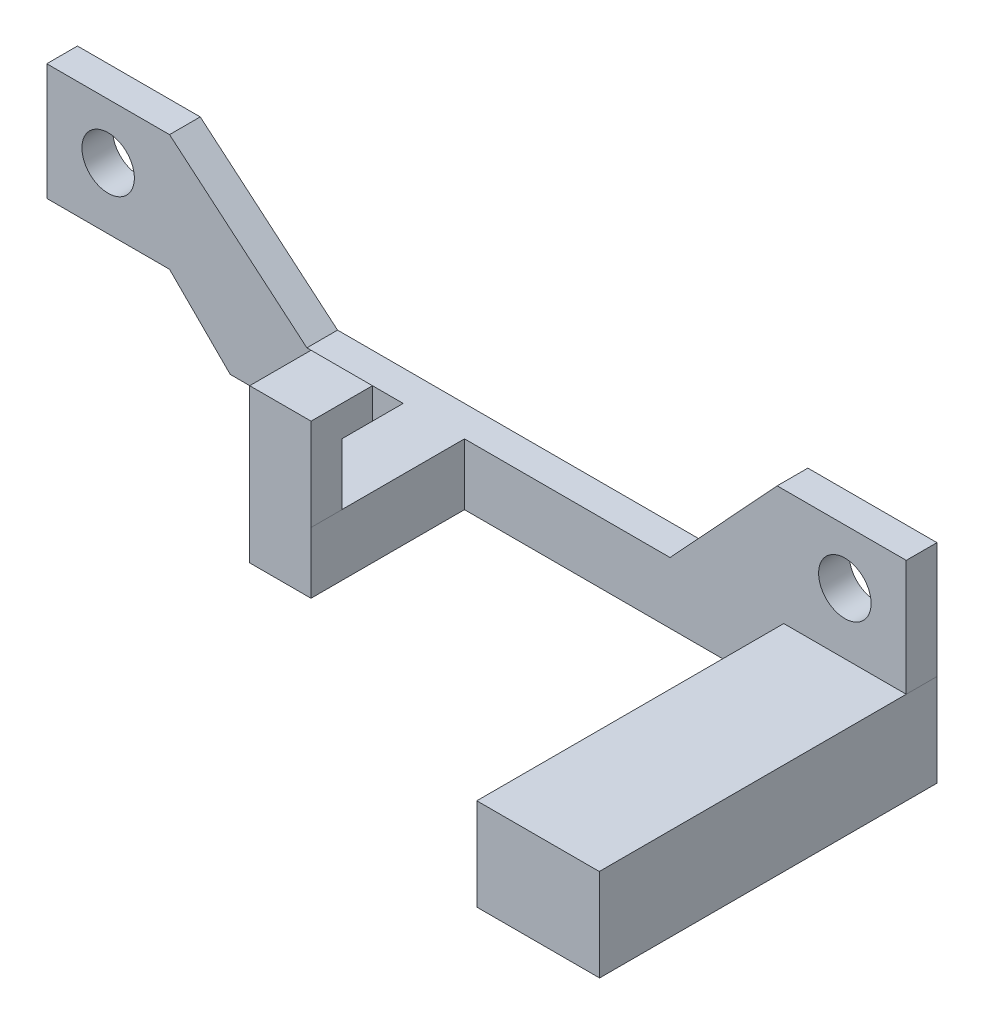
ISO-10303-21;
HEADER;
FILE_DESCRIPTION(('STEP AP214'),'2;1');
FILE_NAME('part.step','',(''),(''),'','','');
FILE_SCHEMA(('AUTOMOTIVE_DESIGN { 1 0 10303 214 1 1 1 1 }'));
ENDSEC;
DATA;
#1=APPLICATION_CONTEXT('core data for automotive mechanical design processes');
#2=APPLICATION_PROTOCOL_DEFINITION('international standard','automotive_design',2000,#1);
#3=PRODUCT_CONTEXT('',#1,'mechanical');
#4=PRODUCT('Part','Part','',(#3));
#5=PRODUCT_RELATED_PRODUCT_CATEGORY('part','',(#4));
#6=PRODUCT_DEFINITION_FORMATION('','',#4);
#7=PRODUCT_DEFINITION_CONTEXT('part definition',#1,'design');
#8=PRODUCT_DEFINITION('design','',#6,#7);
#9=PRODUCT_DEFINITION_SHAPE('','',#8);
#10=(LENGTH_UNIT() NAMED_UNIT(*) SI_UNIT(.MILLI.,.METRE.));
#11=(NAMED_UNIT(*) PLANE_ANGLE_UNIT() SI_UNIT($,.RADIAN.));
#12=(NAMED_UNIT(*) SI_UNIT($,.STERADIAN.) SOLID_ANGLE_UNIT());
#13=UNCERTAINTY_MEASURE_WITH_UNIT(LENGTH_MEASURE(1.E-05),#10,'distance_accuracy_value','');
#14=(GEOMETRIC_REPRESENTATION_CONTEXT(3) GLOBAL_UNCERTAINTY_ASSIGNED_CONTEXT((#13)) GLOBAL_UNIT_ASSIGNED_CONTEXT((#10,
#11,#12)) REPRESENTATION_CONTEXT('',''));
#15=CARTESIAN_POINT('',(0.,0.,0.));
#16=DIRECTION('',(0.,0.,1.));
#17=DIRECTION('',(1.,0.,0.));
#18=AXIS2_PLACEMENT_3D('',#15,#16,#17);
#19=CARTESIAN_POINT('',(0.,0.,2.54));
#20=DIRECTION('',(0.,0.,1.));
#21=DIRECTION('',(1.,0.,0.));
#22=AXIS2_PLACEMENT_3D('',#19,#20,#21);
#23=PLANE('',#22);
#24=CARTESIAN_POINT('',(0.,0.,2.54));
#25=DIRECTION('',(0.,0.,1.));
#26=DIRECTION('',(1.,0.,0.));
#27=AXIS2_PLACEMENT_3D('',#24,#25,#26);
#28=CIRCLE('',#27,2.1717);
#29=CARTESIAN_POINT('',(2.1717,0.,2.54));
#30=VERTEX_POINT('',#29);
#31=EDGE_CURVE('E720',#30,#30,#28,.T.);
#32=ORIENTED_EDGE('',*,*,#31,.F.);
#33=EDGE_LOOP('',(#32));
#34=FACE_BOUND('',#33,.T.);
#35=DIRECTION('',(1.,0.,0.));
#36=VECTOR('',#35,1.);
#37=CARTESIAN_POINT('',(0.,-10.1021143985678,2.54));
#38=LINE('',#37,#36);
#39=CARTESIAN_POINT('',(10.102114398568,-10.1021143985678,2.54));
#40=VERTEX_POINT('',#39);
#41=CARTESIAN_POINT('',(24.4116480258327,-10.1021143985679,2.54));
#42=VERTEX_POINT('',#41);
#43=EDGE_CURVE('E741',#40,#42,#38,.T.);
#44=ORIENTED_EDGE('',*,*,#43,.T.);
#45=DIRECTION('',(0.,-1.,0.));
#46=VECTOR('',#45,1.);
#47=CARTESIAN_POINT('',(24.4116480258327,-5.02527026640652,2.54));
#48=LINE('',#47,#46);
#49=CARTESIAN_POINT('',(24.4116480258327,-5.02527026640652,2.54));
#50=VERTEX_POINT('',#49);
#51=EDGE_CURVE('E626',#50,#42,#48,.T.);
#52=ORIENTED_EDGE('',*,*,#51,.F.);
#53=DIRECTION('',(-1.,0.,0.));
#54=VECTOR('',#53,1.);
#55=CARTESIAN_POINT('',(0.,-5.02527026640652,2.54));
#56=LINE('',#55,#54);
#57=CARTESIAN_POINT('',(16.4442838158998,-5.02527026640652,2.54));
#58=VERTEX_POINT('',#57);
#59=EDGE_CURVE('E66',#50,#58,#56,.T.);
#60=ORIENTED_EDGE('',*,*,#59,.T.);
#61=DIRECTION('',(0.764004598915688,-0.64521079720947,0.));
#62=VECTOR('',#61,1.);
#63=CARTESIAN_POINT('',(4.36852866470301,5.17284584319278,2.54));
#64=LINE('',#63,#62);
#65=CARTESIAN_POINT('',(5.08,4.572,2.54));
#66=VERTEX_POINT('',#65);
#67=EDGE_CURVE('E724',#66,#58,#64,.T.);
#68=ORIENTED_EDGE('',*,*,#67,.F.);
#69=DIRECTION('',(1.,0.,0.));
#70=VECTOR('',#69,1.);
#71=CARTESIAN_POINT('',(0.,4.572,2.54));
#72=LINE('',#71,#70);
#73=CARTESIAN_POINT('',(-5.08,4.572,2.54));
#74=VERTEX_POINT('',#73);
#75=EDGE_CURVE('E727',#74,#66,#72,.T.);
#76=ORIENTED_EDGE('',*,*,#75,.F.);
#77=DIRECTION('',(0.,1.,0.));
#78=VECTOR('',#77,1.);
#79=CARTESIAN_POINT('',(-5.08,0.,2.54));
#80=LINE('',#79,#78);
#81=CARTESIAN_POINT('',(-5.08,-5.08,2.54));
#82=VERTEX_POINT('',#81);
#83=EDGE_CURVE('E203',#82,#74,#80,.T.);
#84=ORIENTED_EDGE('',*,*,#83,.F.);
#85=DIRECTION('',(-1.,0.,0.));
#86=VECTOR('',#85,1.);
#87=CARTESIAN_POINT('',(0.,-5.08,2.54));
#88=LINE('',#87,#86);
#89=CARTESIAN_POINT('',(5.08,-5.08,2.54));
#90=VERTEX_POINT('',#89);
#91=EDGE_CURVE('E732',#90,#82,#88,.T.);
#92=ORIENTED_EDGE('',*,*,#91,.F.);
#93=DIRECTION('',(0.707106781186556,-0.707106781186539,0.));
#94=VECTOR('',#93,1.);
#95=CARTESIAN_POINT('',(0.,0.,2.54));
#96=LINE('',#95,#94);
#97=EDGE_CURVE('E736',#90,#40,#96,.T.);
#98=ORIENTED_EDGE('',*,*,#97,.T.);
#99=EDGE_LOOP('',(#44,#52,#60,#68,#76,#84,#92,#98));
#100=FACE_BOUND('',#99,.T.);
#101=ADVANCED_FACE('F41',(#34,#100),#23,.T.);
#102=CARTESIAN_POINT('',(60.96,0.,2.54));
#103=DIRECTION('',(0.,0.,1.));
#104=DIRECTION('',(1.,0.,0.));
#105=AXIS2_PLACEMENT_3D('',#102,#103,#104);
#106=CIRCLE('',#105,2.17169999999999);
#107=CARTESIAN_POINT('',(63.1317,0.,2.54));
#108=VERTEX_POINT('',#107);
#109=EDGE_CURVE('E248',#108,#108,#106,.T.);
#110=ORIENTED_EDGE('',*,*,#109,.F.);
#111=EDGE_LOOP('',(#110));
#112=FACE_BOUND('',#111,.T.);
#113=CARTESIAN_POINT('',(46.4985645628531,-5.02527026640651,2.54));
#114=VERTEX_POINT('',#113);
#115=CARTESIAN_POINT('',(29.4860322595412,-5.02527026640651,2.54));
#116=VERTEX_POINT('',#115);
#117=EDGE_CURVE('E250',#114,#116,#56,.T.);
#118=ORIENTED_EDGE('',*,*,#117,.T.);
#119=DIRECTION('',(0.,1.,0.));
#120=VECTOR('',#119,1.);
#121=CARTESIAN_POINT('',(29.4860322595412,-10.1021143985679,2.54));
#122=LINE('',#121,#120);
#123=CARTESIAN_POINT('',(29.4860322595412,-10.1021143985679,2.54));
#124=VERTEX_POINT('',#123);
#125=EDGE_CURVE('E646',#124,#116,#122,.T.);
#126=ORIENTED_EDGE('',*,*,#125,.F.);
#127=CARTESIAN_POINT('',(51.2288276745679,-10.1021143985679,2.54));
#128=VERTEX_POINT('',#127);
#129=EDGE_CURVE('E740',#124,#128,#38,.T.);
#130=ORIENTED_EDGE('',*,*,#129,.T.);
#131=DIRECTION('',(0.679491903281779,0.733683006055412,0.));
#132=VECTOR('',#131,1.);
#133=CARTESIAN_POINT('',(32.6122281261883,-30.2034322409393,2.54));
#134=LINE('',#133,#132);
#135=CARTESIAN_POINT('',(55.9053436198552,-5.05263513320329,2.54));
#136=VERTEX_POINT('',#135);
#137=EDGE_CURVE('E745',#128,#136,#134,.T.);
#138=ORIENTED_EDGE('',*,*,#137,.T.);
#139=DIRECTION('',(-1.,0.,0.));
#140=VECTOR('',#139,1.);
#141=CARTESIAN_POINT('',(0.,-5.05263513320329,2.54));
#142=LINE('',#141,#140);
#143=CARTESIAN_POINT('',(66.0399999697102,-5.05263513320329,2.54));
#144=VERTEX_POINT('',#143);
#145=EDGE_CURVE('E749',#144,#136,#142,.T.);
#146=ORIENTED_EDGE('',*,*,#145,.F.);
#147=DIRECTION('',(0.,1.,0.));
#148=VECTOR('',#147,1.);
#149=CARTESIAN_POINT('',(66.0399999697102,0.,2.54));
#150=LINE('',#149,#148);
#151=CARTESIAN_POINT('',(66.0399999697102,4.54395621284335,2.54));
#152=VERTEX_POINT('',#151);
#153=EDGE_CURVE('E155',#144,#152,#150,.T.);
#154=ORIENTED_EDGE('',*,*,#153,.T.);
#155=DIRECTION('',(-1.,0.,0.));
#156=VECTOR('',#155,1.);
#157=CARTESIAN_POINT('',(0.,4.54395621284335,2.54));
#158=LINE('',#157,#156);
#159=CARTESIAN_POINT('',(55.3583605516078,4.54395621284335,2.54));
#160=VERTEX_POINT('',#159);
#161=EDGE_CURVE('E149',#152,#160,#158,.T.);
#162=ORIENTED_EDGE('',*,*,#161,.T.);
#163=DIRECTION('',(-0.679383305109455,-0.733783568048885,0.));
#164=VECTOR('',#163,1.);
#165=CARTESIAN_POINT('',(27.5418084753844,-25.4999507831056,2.54));
#166=LINE('',#165,#164);
#167=EDGE_CURVE('E137',#160,#114,#166,.T.);
#168=ORIENTED_EDGE('',*,*,#167,.T.);
#169=EDGE_LOOP('',(#118,#126,#130,#138,#146,#154,#162,#168));
#170=FACE_BOUND('',#169,.T.);
#171=ADVANCED_FACE('F152',(#112,#170),#23,.T.);
#172=CARTESIAN_POINT('',(4.36852866470301,5.17284584319278,2.54));
#173=DIRECTION('',(0.64521079720947,0.764004598915688,0.));
#174=DIRECTION('',(-0.764004598915688,0.64521079720947,0.));
#175=AXIS2_PLACEMENT_3D('',#172,#173,#174);
#176=PLANE('',#175);
#177=DIRECTION('',(0.764004598915688,-0.64521079720947,0.));
#178=VECTOR('',#177,1.);
#179=CARTESIAN_POINT('',(4.36852866470301,5.17284584319278,0.));
#180=LINE('',#179,#178);
#181=CARTESIAN_POINT('',(5.08,4.572,0.));
#182=VERTEX_POINT('',#181);
#183=CARTESIAN_POINT('',(16.4442838158998,-5.02527026640652,0.));
#184=VERTEX_POINT('',#183);
#185=EDGE_CURVE('E213',#182,#184,#180,.T.);
#186=ORIENTED_EDGE('',*,*,#185,.F.);
#187=DIRECTION('',(0.,0.,-1.));
#188=VECTOR('',#187,1.);
#189=CARTESIAN_POINT('',(5.08,4.572,2.54));
#190=LINE('',#189,#188);
#191=EDGE_CURVE('E11',#66,#182,#190,.T.);
#192=ORIENTED_EDGE('',*,*,#191,.F.);
#193=ORIENTED_EDGE('',*,*,#67,.T.);
#194=DIRECTION('',(0.,0.,-1.));
#195=VECTOR('',#194,1.);
#196=CARTESIAN_POINT('',(16.4442838158998,-5.02527026640652,2.54));
#197=LINE('',#196,#195);
#198=EDGE_CURVE('E108',#58,#184,#197,.T.);
#199=ORIENTED_EDGE('',*,*,#198,.T.);
#200=EDGE_LOOP('',(#186,#192,#193,#199));
#201=FACE_BOUND('',#200,.T.);
#202=ADVANCED_FACE('F265',(#201),#176,.T.);
#203=CARTESIAN_POINT('',(0.,4.572,2.54));
#204=DIRECTION('',(0.,1.,0.));
#205=DIRECTION('',(0.,0.,1.));
#206=AXIS2_PLACEMENT_3D('',#203,#204,#205);
#207=PLANE('',#206);
#208=DIRECTION('',(1.,0.,0.));
#209=VECTOR('',#208,1.);
#210=CARTESIAN_POINT('',(0.,4.572,0.));
#211=LINE('',#210,#209);
#212=CARTESIAN_POINT('',(-5.08,4.572,0.));
#213=VERTEX_POINT('',#212);
#214=EDGE_CURVE('E208',#213,#182,#211,.T.);
#215=ORIENTED_EDGE('',*,*,#214,.F.);
#216=DIRECTION('',(0.,0.,-1.));
#217=VECTOR('',#216,1.);
#218=CARTESIAN_POINT('',(-5.08,4.572,2.54));
#219=LINE('',#218,#217);
#220=EDGE_CURVE('E50',#74,#213,#219,.T.);
#221=ORIENTED_EDGE('',*,*,#220,.F.);
#222=ORIENTED_EDGE('',*,*,#75,.T.);
#223=ORIENTED_EDGE('',*,*,#191,.T.);
#224=EDGE_LOOP('',(#215,#221,#222,#223));
#225=FACE_BOUND('',#224,.T.);
#226=ADVANCED_FACE('F209',(#225),#207,.T.);
#227=CARTESIAN_POINT('',(-5.08,0.,2.54));
#228=DIRECTION('',(-1.,0.,0.));
#229=DIRECTION('',(0.,0.,1.));
#230=AXIS2_PLACEMENT_3D('',#227,#228,#229);
#231=PLANE('',#230);
#232=DIRECTION('',(0.,1.,0.));
#233=VECTOR('',#232,1.);
#234=CARTESIAN_POINT('',(-5.08,0.,0.));
#235=LINE('',#234,#233);
#236=CARTESIAN_POINT('',(-5.08,-5.08,0.));
#237=VERTEX_POINT('',#236);
#238=EDGE_CURVE('E200',#237,#213,#235,.T.);
#239=ORIENTED_EDGE('',*,*,#238,.F.);
#240=DIRECTION('',(0.,0.,-1.));
#241=VECTOR('',#240,1.);
#242=CARTESIAN_POINT('',(-5.08,-5.08,2.54));
#243=LINE('',#242,#241);
#244=EDGE_CURVE('E191',#82,#237,#243,.T.);
#245=ORIENTED_EDGE('',*,*,#244,.F.);
#246=ORIENTED_EDGE('',*,*,#83,.T.);
#247=ORIENTED_EDGE('',*,*,#220,.T.);
#248=EDGE_LOOP('',(#239,#245,#246,#247));
#249=FACE_BOUND('',#248,.T.);
#250=ADVANCED_FACE('F198',(#249),#231,.T.);
#251=CARTESIAN_POINT('',(0.,-5.08,2.54));
#252=DIRECTION('',(0.,-1.,0.));
#253=DIRECTION('',(1.,0.,0.));
#254=AXIS2_PLACEMENT_3D('',#251,#252,#253);
#255=PLANE('',#254);
#256=DIRECTION('',(-1.,0.,0.));
#257=VECTOR('',#256,1.);
#258=CARTESIAN_POINT('',(0.,-5.08,0.));
#259=LINE('',#258,#257);
#260=CARTESIAN_POINT('',(5.08,-5.08,0.));
#261=VERTEX_POINT('',#260);
#262=EDGE_CURVE('E218',#261,#237,#259,.T.);
#263=ORIENTED_EDGE('',*,*,#262,.F.);
#264=DIRECTION('',(0.,0.,-1.));
#265=VECTOR('',#264,1.);
#266=CARTESIAN_POINT('',(5.08,-5.08,2.54));
#267=LINE('',#266,#265);
#268=EDGE_CURVE('E188',#90,#261,#267,.T.);
#269=ORIENTED_EDGE('',*,*,#268,.F.);
#270=ORIENTED_EDGE('',*,*,#91,.T.);
#271=ORIENTED_EDGE('',*,*,#244,.T.);
#272=EDGE_LOOP('',(#263,#269,#270,#271));
#273=FACE_BOUND('',#272,.T.);
#274=ADVANCED_FACE('F311',(#273),#255,.T.);
#275=CARTESIAN_POINT('',(0.,0.,2.54));
#276=DIRECTION('',(0.707106781186539,0.707106781186556,0.));
#277=DIRECTION('',(-0.707106781186556,0.707106781186539,0.));
#278=AXIS2_PLACEMENT_3D('',#275,#276,#277);
#279=PLANE('',#278);
#280=DIRECTION('',(0.707106781186556,-0.707106781186539,0.));
#281=VECTOR('',#280,1.);
#282=CARTESIAN_POINT('',(0.,0.,0.));
#283=LINE('',#282,#281);
#284=CARTESIAN_POINT('',(10.102114398568,-10.1021143985678,0.));
#285=VERTEX_POINT('',#284);
#286=EDGE_CURVE('E222',#261,#285,#283,.T.);
#287=ORIENTED_EDGE('',*,*,#286,.T.);
#288=DIRECTION('',(0.,0.,-1.));
#289=VECTOR('',#288,1.);
#290=CARTESIAN_POINT('',(10.102114398568,-10.1021143985678,2.54));
#291=LINE('',#290,#289);
#292=EDGE_CURVE('E184',#40,#285,#291,.T.);
#293=ORIENTED_EDGE('',*,*,#292,.F.);
#294=ORIENTED_EDGE('',*,*,#97,.F.);
#295=ORIENTED_EDGE('',*,*,#268,.T.);
#296=EDGE_LOOP('',(#287,#293,#294,#295));
#297=FACE_BOUND('',#296,.T.);
#298=ADVANCED_FACE('F307',(#297),#279,.F.);
#299=CARTESIAN_POINT('',(0.,-10.1021143985678,2.54));
#300=DIRECTION('',(0.,1.,0.));
#301=DIRECTION('',(-1.,0.,0.));
#302=AXIS2_PLACEMENT_3D('',#299,#300,#301);
#303=PLANE('',#302);
#304=DIRECTION('',(1.,0.,0.));
#305=VECTOR('',#304,1.);
#306=CARTESIAN_POINT('',(0.,-10.1021143985678,0.));
#307=LINE('',#306,#305);
#308=CARTESIAN_POINT('',(51.2288276745679,-10.1021143985679,0.));
#309=VERTEX_POINT('',#308);
#310=EDGE_CURVE('E229',#285,#309,#307,.T.);
#311=ORIENTED_EDGE('',*,*,#310,.T.);
#312=DIRECTION('',(0.,0.,-1.));
#313=VECTOR('',#312,1.);
#314=CARTESIAN_POINT('',(51.2288276745679,-10.1021143985679,2.54));
#315=LINE('',#314,#313);
#316=EDGE_CURVE('E180',#128,#309,#315,.T.);
#317=ORIENTED_EDGE('',*,*,#316,.F.);
#318=ORIENTED_EDGE('',*,*,#129,.F.);
#319=DIRECTION('',(0.,0.,-1.));
#320=VECTOR('',#319,1.);
#321=CARTESIAN_POINT('',(29.4860322595412,-10.1021143985679,15.24));
#322=LINE('',#321,#320);
#323=CARTESIAN_POINT('',(29.4860322595412,-10.1021143985679,15.24));
#324=VERTEX_POINT('',#323);
#325=EDGE_CURVE('E57',#324,#124,#322,.T.);
#326=ORIENTED_EDGE('',*,*,#325,.F.);
#327=DIRECTION('',(1.,0.,0.));
#328=VECTOR('',#327,1.);
#329=CARTESIAN_POINT('',(24.4116480258327,-10.1021143985679,15.24));
#330=LINE('',#329,#328);
#331=CARTESIAN_POINT('',(24.4116480258327,-10.1021143985679,15.24));
#332=VERTEX_POINT('',#331);
#333=EDGE_CURVE('E645',#332,#324,#330,.T.);
#334=ORIENTED_EDGE('',*,*,#333,.F.);
#335=DIRECTION('',(0.,0.,-1.));
#336=VECTOR('',#335,1.);
#337=CARTESIAN_POINT('',(24.4116480258327,-10.1021143985679,15.24));
#338=LINE('',#337,#336);
#339=EDGE_CURVE('E666',#332,#42,#338,.T.);
#340=ORIENTED_EDGE('',*,*,#339,.T.);
#341=ORIENTED_EDGE('',*,*,#43,.F.);
#342=ORIENTED_EDGE('',*,*,#292,.T.);
#343=EDGE_LOOP('',(#311,#317,#318,#326,#334,#340,#341,#342));
#344=FACE_BOUND('',#343,.T.);
#345=ADVANCED_FACE('F303',(#344),#303,.F.);
#346=CARTESIAN_POINT('',(32.6122281261883,-30.2034322409393,2.54));
#347=DIRECTION('',(-0.733683006055412,0.679491903281779,0.));
#348=DIRECTION('',(-0.679491903281779,-0.733683006055412,0.));
#349=AXIS2_PLACEMENT_3D('',#346,#347,#348);
#350=PLANE('',#349);
#351=DIRECTION('',(0.679491903281779,0.733683006055412,0.));
#352=VECTOR('',#351,1.);
#353=CARTESIAN_POINT('',(32.6122281261883,-30.2034322409393,0.));
#354=LINE('',#353,#352);
#355=CARTESIAN_POINT('',(55.9053436198552,-5.05263513320329,0.));
#356=VERTEX_POINT('',#355);
#357=EDGE_CURVE('E233',#309,#356,#354,.T.);
#358=ORIENTED_EDGE('',*,*,#357,.T.);
#359=DIRECTION('',(0.,0.,-1.));
#360=VECTOR('',#359,1.);
#361=CARTESIAN_POINT('',(55.9053436198552,-5.05263513320329,2.54));
#362=LINE('',#361,#360);
#363=EDGE_CURVE('E176',#136,#356,#362,.T.);
#364=ORIENTED_EDGE('',*,*,#363,.F.);
#365=ORIENTED_EDGE('',*,*,#137,.F.);
#366=ORIENTED_EDGE('',*,*,#316,.T.);
#367=EDGE_LOOP('',(#358,#364,#365,#366));
#368=FACE_BOUND('',#367,.T.);
#369=ADVANCED_FACE('F299',(#368),#350,.F.);
#370=CARTESIAN_POINT('',(66.0399999697102,0.,2.54));
#371=DIRECTION('',(-1.,0.,0.));
#372=DIRECTION('',(0.,0.,1.));
#373=AXIS2_PLACEMENT_3D('',#370,#371,#372);
#374=PLANE('',#373);
#375=DIRECTION('',(0.,1.,0.));
#376=VECTOR('',#375,1.);
#377=CARTESIAN_POINT('',(66.0399999697102,0.,0.));
#378=LINE('',#377,#376);
#379=CARTESIAN_POINT('',(66.0399999697102,-5.05263513320329,0.));
#380=VERTEX_POINT('',#379);
#381=CARTESIAN_POINT('',(66.0399999697102,4.54395621284335,0.));
#382=VERTEX_POINT('',#381);
#383=EDGE_CURVE('E237',#380,#382,#378,.T.);
#384=ORIENTED_EDGE('',*,*,#383,.T.);
#385=DIRECTION('',(0.,0.,-1.));
#386=VECTOR('',#385,1.);
#387=CARTESIAN_POINT('',(66.0399999697102,4.54395621284335,2.54));
#388=LINE('',#387,#386);
#389=EDGE_CURVE('E164',#152,#382,#388,.T.);
#390=ORIENTED_EDGE('',*,*,#389,.F.);
#391=ORIENTED_EDGE('',*,*,#153,.F.);
#392=DIRECTION('',(0.,0.,-1.));
#393=VECTOR('',#392,1.);
#394=CARTESIAN_POINT('',(66.0399999697102,-5.05263513320329,2.54));
#395=LINE('',#394,#393);
#396=EDGE_CURVE('E168',#144,#380,#395,.T.);
#397=ORIENTED_EDGE('',*,*,#396,.T.);
#398=EDGE_LOOP('',(#384,#390,#391,#397));
#399=FACE_BOUND('',#398,.T.);
#400=ADVANCED_FACE('F296',(#399),#374,.F.);
#401=CARTESIAN_POINT('',(0.,4.54395621284335,2.54));
#402=DIRECTION('',(0.,-1.,0.));
#403=DIRECTION('',(0.,0.,-1.));
#404=AXIS2_PLACEMENT_3D('',#401,#402,#403);
#405=PLANE('',#404);
#406=DIRECTION('',(-1.,0.,0.));
#407=VECTOR('',#406,1.);
#408=CARTESIAN_POINT('',(0.,4.54395621284335,0.));
#409=LINE('',#408,#407);
#410=CARTESIAN_POINT('',(55.3583605516078,4.54395621284335,0.));
#411=VERTEX_POINT('',#410);
#412=EDGE_CURVE('E162',#382,#411,#409,.T.);
#413=ORIENTED_EDGE('',*,*,#412,.T.);
#414=DIRECTION('',(0.,0.,-1.));
#415=VECTOR('',#414,1.);
#416=CARTESIAN_POINT('',(55.3583605516078,4.54395621284335,2.54));
#417=LINE('',#416,#415);
#418=EDGE_CURVE('E142',#160,#411,#417,.T.);
#419=ORIENTED_EDGE('',*,*,#418,.F.);
#420=ORIENTED_EDGE('',*,*,#161,.F.);
#421=ORIENTED_EDGE('',*,*,#389,.T.);
#422=EDGE_LOOP('',(#413,#419,#420,#421));
#423=FACE_BOUND('',#422,.T.);
#424=ADVANCED_FACE('F161',(#423),#405,.F.);
#425=CARTESIAN_POINT('',(27.5418084753844,-25.4999507831056,2.54));
#426=DIRECTION('',(0.733783568048885,-0.679383305109455,0.));
#427=DIRECTION('',(0.679383305109455,0.733783568048885,0.));
#428=AXIS2_PLACEMENT_3D('',#425,#426,#427);
#429=PLANE('',#428);
#430=DIRECTION('',(-0.679383305109455,-0.733783568048885,0.));
#431=VECTOR('',#430,1.);
#432=CARTESIAN_POINT('',(27.5418084753844,-25.4999507831056,0.));
#433=LINE('',#432,#431);
#434=CARTESIAN_POINT('',(46.4985645628531,-5.02527026640651,0.));
#435=VERTEX_POINT('',#434);
#436=EDGE_CURVE('E243',#411,#435,#433,.T.);
#437=ORIENTED_EDGE('',*,*,#436,.T.);
#438=DIRECTION('',(0.,0.,-1.));
#439=VECTOR('',#438,1.);
#440=CARTESIAN_POINT('',(46.4985645628531,-5.02527026640651,2.54));
#441=LINE('',#440,#439);
#442=EDGE_CURVE('E145',#114,#435,#441,.T.);
#443=ORIENTED_EDGE('',*,*,#442,.F.);
#444=ORIENTED_EDGE('',*,*,#167,.F.);
#445=ORIENTED_EDGE('',*,*,#418,.T.);
#446=EDGE_LOOP('',(#437,#443,#444,#445));
#447=FACE_BOUND('',#446,.T.);
#448=ADVANCED_FACE('F140',(#447),#429,.F.);
#449=CARTESIAN_POINT('',(0.,0.,2.54));
#450=DIRECTION('',(0.,0.,-1.));
#451=DIRECTION('',(-1.,0.,0.));
#452=AXIS2_PLACEMENT_3D('',#449,#450,#451);
#453=CYLINDRICAL_SURFACE('',#452,2.1717);
#454=ORIENTED_EDGE('',*,*,#31,.T.);
#455=EDGE_LOOP('',(#454));
#456=FACE_BOUND('',#455,.T.);
#457=CARTESIAN_POINT('',(0.,0.,0.));
#458=DIRECTION('',(0.,0.,1.));
#459=DIRECTION('',(1.,0.,0.));
#460=AXIS2_PLACEMENT_3D('',#457,#458,#459);
#461=CIRCLE('',#460,2.1717);
#462=CARTESIAN_POINT('',(2.1717,0.,0.));
#463=VERTEX_POINT('',#462);
#464=EDGE_CURVE('E260',#463,#463,#461,.T.);
#465=ORIENTED_EDGE('',*,*,#464,.F.);
#466=EDGE_LOOP('',(#465));
#467=FACE_BOUND('',#466,.T.);
#468=ADVANCED_FACE('F293',(#456,#467),#453,.F.);
#469=CARTESIAN_POINT('',(60.96,0.,2.54));
#470=DIRECTION('',(0.,0.,-1.));
#471=DIRECTION('',(-1.,0.,0.));
#472=AXIS2_PLACEMENT_3D('',#469,#470,#471);
#473=CYLINDRICAL_SURFACE('',#472,2.17169999999999);
#474=ORIENTED_EDGE('',*,*,#109,.T.);
#475=EDGE_LOOP('',(#474));
#476=FACE_BOUND('',#475,.T.);
#477=CARTESIAN_POINT('',(60.96,0.,0.));
#478=DIRECTION('',(0.,0.,1.));
#479=DIRECTION('',(1.,0.,0.));
#480=AXIS2_PLACEMENT_3D('',#477,#478,#479);
#481=CIRCLE('',#480,2.17169999999999);
#482=CARTESIAN_POINT('',(63.1317,0.,0.));
#483=VERTEX_POINT('',#482);
#484=EDGE_CURVE('E256',#483,#483,#481,.T.);
#485=ORIENTED_EDGE('',*,*,#484,.F.);
#486=EDGE_LOOP('',(#485));
#487=FACE_BOUND('',#486,.T.);
#488=ADVANCED_FACE('F43',(#476,#487),#473,.F.);
#489=CARTESIAN_POINT('',(0.,-5.02527026640652,2.54));
#490=DIRECTION('',(0.,-1.,0.));
#491=DIRECTION('',(1.,0.,0.));
#492=AXIS2_PLACEMENT_3D('',#489,#490,#491);
#493=PLANE('',#492);
#494=DIRECTION('',(0.,0.,-1.));
#495=VECTOR('',#494,1.);
#496=CARTESIAN_POINT('',(24.4116480258327,-5.02527026640652,15.24));
#497=LINE('',#496,#495);
#498=CARTESIAN_POINT('',(24.4116480258327,-5.02527026640652,12.6998475871327));
#499=VERTEX_POINT('',#498);
#500=EDGE_CURVE('E670',#499,#50,#497,.T.);
#501=ORIENTED_EDGE('',*,*,#500,.F.);
#502=DIRECTION('',(-1.,0.,0.));
#503=VECTOR('',#502,1.);
#504=CARTESIAN_POINT('',(29.4916480258327,-5.02527026640652,12.6998475871327));
#505=LINE('',#504,#503);
#506=CARTESIAN_POINT('',(29.4860322595412,-5.02527026640652,12.6998475871327));
#507=VERTEX_POINT('',#506);
#508=EDGE_CURVE('E627',#507,#499,#505,.T.);
#509=ORIENTED_EDGE('',*,*,#508,.F.);
#510=DIRECTION('',(0.,0.,-1.));
#511=VECTOR('',#510,1.);
#512=CARTESIAN_POINT('',(29.4860322595412,-5.02527026640651,15.24));
#513=LINE('',#512,#511);
#514=EDGE_CURVE('E654',#507,#116,#513,.T.);
#515=ORIENTED_EDGE('',*,*,#514,.T.);
#516=ORIENTED_EDGE('',*,*,#117,.F.);
#517=ORIENTED_EDGE('',*,*,#442,.T.);
#518=DIRECTION('',(-1.,0.,0.));
#519=VECTOR('',#518,1.);
#520=CARTESIAN_POINT('',(0.,-5.02527026640652,0.));
#521=LINE('',#520,#519);
#522=EDGE_CURVE('E246',#435,#184,#521,.T.);
#523=ORIENTED_EDGE('',*,*,#522,.T.);
#524=ORIENTED_EDGE('',*,*,#198,.F.);
#525=ORIENTED_EDGE('',*,*,#59,.F.);
#526=EDGE_LOOP('',(#501,#509,#515,#516,#517,#523,#524,#525));
#527=FACE_BOUND('',#526,.T.);
#528=ADVANCED_FACE('F286',(#527),#493,.F.);
#529=CARTESIAN_POINT('',(0.,0.,0.));
#530=DIRECTION('',(0.,0.,1.));
#531=DIRECTION('',(1.,0.,0.));
#532=AXIS2_PLACEMENT_3D('',#529,#530,#531);
#533=PLANE('',#532);
#534=ORIENTED_EDGE('',*,*,#484,.T.);
#535=EDGE_LOOP('',(#534));
#536=FACE_BOUND('',#535,.T.);
#537=ORIENTED_EDGE('',*,*,#464,.T.);
#538=EDGE_LOOP('',(#537));
#539=FACE_BOUND('',#538,.T.);
#540=ORIENTED_EDGE('',*,*,#185,.T.);
#541=ORIENTED_EDGE('',*,*,#522,.F.);
#542=ORIENTED_EDGE('',*,*,#436,.F.);
#543=ORIENTED_EDGE('',*,*,#412,.F.);
#544=ORIENTED_EDGE('',*,*,#383,.F.);
#545=DIRECTION('',(-0.00332591994385019,0.999994469112968,0.));
#546=VECTOR('',#545,1.);
#547=CARTESIAN_POINT('',(66.0399999697102,-5.05263513320329,0.));
#548=LINE('',#547,#546);
#549=CARTESIAN_POINT('',(66.0653436198552,-12.6726351332033,0.));
#550=VERTEX_POINT('',#549);
#551=EDGE_CURVE('E698',#550,#380,#548,.T.);
#552=ORIENTED_EDGE('',*,*,#551,.F.);
#553=DIRECTION('',(1.,0.,0.));
#554=VECTOR('',#553,1.);
#555=CARTESIAN_POINT('',(55.9053436198552,-12.6726351332033,0.));
#556=LINE('',#555,#554);
#557=CARTESIAN_POINT('',(55.9053436198552,-12.6726351332033,0.));
#558=VERTEX_POINT('',#557);
#559=EDGE_CURVE('E694',#558,#550,#556,.T.);
#560=ORIENTED_EDGE('',*,*,#559,.F.);
#561=DIRECTION('',(0.,-1.,0.));
#562=VECTOR('',#561,1.);
#563=CARTESIAN_POINT('',(55.9053436198552,-5.05263513320329,0.));
#564=LINE('',#563,#562);
#565=EDGE_CURVE('E690',#356,#558,#564,.T.);
#566=ORIENTED_EDGE('',*,*,#565,.F.);
#567=ORIENTED_EDGE('',*,*,#357,.F.);
#568=ORIENTED_EDGE('',*,*,#310,.F.);
#569=ORIENTED_EDGE('',*,*,#286,.F.);
#570=ORIENTED_EDGE('',*,*,#262,.T.);
#571=ORIENTED_EDGE('',*,*,#238,.T.);
#572=ORIENTED_EDGE('',*,*,#214,.T.);
#573=EDGE_LOOP('',(#540,#541,#542,#543,#544,#552,#560,#566,#567,#568,#569,#570,#571,#572));
#574=FACE_BOUND('',#573,.T.);
#575=ADVANCED_FACE('F215',(#536,#539,#574),#533,.F.);
#576=CARTESIAN_POINT('',(66.0399999697102,-5.05263513320329,0.));
#577=DIRECTION('',(0.,1.,0.));
#578=DIRECTION('',(-1.,0.,0.));
#579=AXIS2_PLACEMENT_3D('',#576,#577,#578);
#580=PLANE('',#579);
#581=DIRECTION('',(0.,0.,1.));
#582=VECTOR('',#581,1.);
#583=CARTESIAN_POINT('',(66.0399999697102,-5.05263513320329,0.));
#584=LINE('',#583,#582);
#585=CARTESIAN_POINT('',(66.0399999697102,-5.05263513320329,27.94));
#586=VERTEX_POINT('',#585);
#587=EDGE_CURVE('E261',#144,#586,#584,.T.);
#588=ORIENTED_EDGE('',*,*,#587,.F.);
#589=ORIENTED_EDGE('',*,*,#145,.T.);
#590=DIRECTION('',(0.,0.,1.));
#591=VECTOR('',#590,1.);
#592=CARTESIAN_POINT('',(55.9053436198552,-5.05263513320329,0.));
#593=LINE('',#592,#591);
#594=CARTESIAN_POINT('',(55.9053436198552,-5.05263513320329,27.94));
#595=VERTEX_POINT('',#594);
#596=EDGE_CURVE('E702',#136,#595,#593,.T.);
#597=ORIENTED_EDGE('',*,*,#596,.T.);
#598=DIRECTION('',(-1.,0.,0.));
#599=VECTOR('',#598,1.);
#600=CARTESIAN_POINT('',(66.0399999697102,-5.05263513320329,27.94));
#601=LINE('',#600,#599);
#602=EDGE_CURVE('E674',#586,#595,#601,.T.);
#603=ORIENTED_EDGE('',*,*,#602,.F.);
#604=EDGE_LOOP('',(#588,#589,#597,#603));
#605=FACE_BOUND('',#604,.T.);
#606=ADVANCED_FACE('F282',(#605),#580,.T.);
#607=CARTESIAN_POINT('',(66.0399999697102,-5.05263513320329,0.));
#608=DIRECTION('',(0.999994469112968,0.00332591994385019,0.));
#609=DIRECTION('',(-0.00332591994385019,0.999994469112968,0.));
#610=AXIS2_PLACEMENT_3D('',#607,#608,#609);
#611=PLANE('',#610);
#612=ORIENTED_EDGE('',*,*,#396,.F.);
#613=ORIENTED_EDGE('',*,*,#587,.T.);
#614=DIRECTION('',(-0.00332591994385019,0.999994469112968,0.));
#615=VECTOR('',#614,1.);
#616=CARTESIAN_POINT('',(66.0399999697102,-5.05263513320329,27.94));
#617=LINE('',#616,#615);
#618=CARTESIAN_POINT('',(66.0653436198552,-12.6726351332033,27.94));
#619=VERTEX_POINT('',#618);
#620=EDGE_CURVE('E686',#619,#586,#617,.T.);
#621=ORIENTED_EDGE('',*,*,#620,.F.);
#622=DIRECTION('',(0.,0.,1.));
#623=VECTOR('',#622,1.);
#624=CARTESIAN_POINT('',(66.0653436198552,-12.6726351332033,0.));
#625=LINE('',#624,#623);
#626=EDGE_CURVE('E706',#550,#619,#625,.T.);
#627=ORIENTED_EDGE('',*,*,#626,.F.);
#628=ORIENTED_EDGE('',*,*,#551,.T.);
#629=EDGE_LOOP('',(#612,#613,#621,#627,#628));
#630=FACE_BOUND('',#629,.T.);
#631=ADVANCED_FACE('F377',(#630),#611,.T.);
#632=CARTESIAN_POINT('',(55.9053436198552,-12.6726351332033,0.));
#633=DIRECTION('',(0.,-1.,0.));
#634=DIRECTION('',(0.,0.,-1.));
#635=AXIS2_PLACEMENT_3D('',#632,#633,#634);
#636=PLANE('',#635);
#637=ORIENTED_EDGE('',*,*,#626,.T.);
#638=DIRECTION('',(1.,0.,0.));
#639=VECTOR('',#638,1.);
#640=CARTESIAN_POINT('',(55.9053436198552,-12.6726351332033,27.94));
#641=LINE('',#640,#639);
#642=CARTESIAN_POINT('',(55.9053436198552,-12.6726351332033,27.94));
#643=VERTEX_POINT('',#642);
#644=EDGE_CURVE('E682',#643,#619,#641,.T.);
#645=ORIENTED_EDGE('',*,*,#644,.F.);
#646=DIRECTION('',(0.,0.,1.));
#647=VECTOR('',#646,1.);
#648=CARTESIAN_POINT('',(55.9053436198552,-12.6726351332033,0.));
#649=LINE('',#648,#647);
#650=EDGE_CURVE('E710',#558,#643,#649,.T.);
#651=ORIENTED_EDGE('',*,*,#650,.F.);
#652=ORIENTED_EDGE('',*,*,#559,.T.);
#653=EDGE_LOOP('',(#637,#645,#651,#652));
#654=FACE_BOUND('',#653,.T.);
#655=ADVANCED_FACE('F384',(#654),#636,.T.);
#656=CARTESIAN_POINT('',(55.9053436198552,-5.05263513320329,0.));
#657=DIRECTION('',(-1.,0.,0.));
#658=DIRECTION('',(0.,0.,1.));
#659=AXIS2_PLACEMENT_3D('',#656,#657,#658);
#660=PLANE('',#659);
#661=ORIENTED_EDGE('',*,*,#650,.T.);
#662=DIRECTION('',(0.,-1.,0.));
#663=VECTOR('',#662,1.);
#664=CARTESIAN_POINT('',(55.9053436198552,-5.05263513320329,27.94));
#665=LINE('',#664,#663);
#666=EDGE_CURVE('E678',#595,#643,#665,.T.);
#667=ORIENTED_EDGE('',*,*,#666,.F.);
#668=ORIENTED_EDGE('',*,*,#596,.F.);
#669=ORIENTED_EDGE('',*,*,#363,.T.);
#670=ORIENTED_EDGE('',*,*,#565,.T.);
#671=EDGE_LOOP('',(#661,#667,#668,#669,#670));
#672=FACE_BOUND('',#671,.T.);
#673=ADVANCED_FACE('F392',(#672),#660,.T.);
#674=CARTESIAN_POINT('',(0.,0.,27.94));
#675=DIRECTION('',(0.,0.,1.));
#676=DIRECTION('',(1.,0.,0.));
#677=AXIS2_PLACEMENT_3D('',#674,#675,#676);
#678=PLANE('',#677);
#679=ORIENTED_EDGE('',*,*,#602,.T.);
#680=ORIENTED_EDGE('',*,*,#666,.T.);
#681=ORIENTED_EDGE('',*,*,#644,.T.);
#682=ORIENTED_EDGE('',*,*,#620,.T.);
#683=EDGE_LOOP('',(#679,#680,#681,#682));
#684=FACE_BOUND('',#683,.T.);
#685=ADVANCED_FACE('F400',(#684),#678,.T.);
#686=CARTESIAN_POINT('',(24.4116480258327,-5.02527026640652,15.24));
#687=DIRECTION('',(1.,0.,0.));
#688=DIRECTION('',(0.,0.,-1.));
#689=AXIS2_PLACEMENT_3D('',#686,#687,#688);
#690=PLANE('',#689);
#691=ORIENTED_EDGE('',*,*,#51,.T.);
#692=ORIENTED_EDGE('',*,*,#339,.F.);
#693=DIRECTION('',(0.,-1.,0.));
#694=VECTOR('',#693,1.);
#695=CARTESIAN_POINT('',(24.4116480258327,-5.02527026640652,15.24));
#696=LINE('',#695,#694);
#697=CARTESIAN_POINT('',(24.4116480258327,2.59472973359348,15.24));
#698=VERTEX_POINT('',#697);
#699=EDGE_CURVE('E641',#698,#332,#696,.T.);
#700=ORIENTED_EDGE('',*,*,#699,.F.);
#701=DIRECTION('',(0.,0.,-1.));
#702=VECTOR('',#701,1.);
#703=CARTESIAN_POINT('',(24.4116480258327,2.59472973359348,12.6998475871327));
#704=LINE('',#703,#702);
#705=CARTESIAN_POINT('',(24.4116480258327,2.59472973359348,10.1598475871327));
#706=VERTEX_POINT('',#705);
#707=EDGE_CURVE('E609',#698,#706,#704,.T.);
#708=ORIENTED_EDGE('',*,*,#707,.T.);
#709=DIRECTION('',(0.,-1.,0.));
#710=VECTOR('',#709,1.);
#711=CARTESIAN_POINT('',(24.4116480258327,2.59472973359348,10.1598475871327));
#712=LINE('',#711,#710);
#713=CARTESIAN_POINT('',(24.4116480258327,0.0547297335934832,10.1598475871327));
#714=VERTEX_POINT('',#713);
#715=EDGE_CURVE('E613',#706,#714,#712,.T.);
#716=ORIENTED_EDGE('',*,*,#715,.T.);
#717=DIRECTION('',(0.,0.,1.));
#718=VECTOR('',#717,1.);
#719=CARTESIAN_POINT('',(24.4116480258327,0.0547297335934832,10.1598475871327));
#720=LINE('',#719,#718);
#721=CARTESIAN_POINT('',(24.4116480258327,0.0547297335934832,12.6998475871327));
#722=VERTEX_POINT('',#721);
#723=EDGE_CURVE('E617',#714,#722,#720,.T.);
#724=ORIENTED_EDGE('',*,*,#723,.T.);
#725=DIRECTION('',(0.,-1.,0.));
#726=VECTOR('',#725,1.);
#727=CARTESIAN_POINT('',(24.4116480258327,0.0547297335934832,12.6998475871327));
#728=LINE('',#727,#726);
#729=EDGE_CURVE('E586',#722,#499,#728,.T.);
#730=ORIENTED_EDGE('',*,*,#729,.T.);
#731=ORIENTED_EDGE('',*,*,#500,.T.);
#732=EDGE_LOOP('',(#691,#692,#700,#708,#716,#724,#730,#731));
#733=FACE_BOUND('',#732,.T.);
#734=ADVANCED_FACE('F407',(#733),#690,.F.);
#735=CARTESIAN_POINT('',(29.4860322595412,-10.1021143985679,15.24));
#736=DIRECTION('',(-1.,0.,0.));
#737=DIRECTION('',(0.,0.,1.));
#738=AXIS2_PLACEMENT_3D('',#735,#736,#737);
#739=PLANE('',#738);
#740=ORIENTED_EDGE('',*,*,#125,.T.);
#741=ORIENTED_EDGE('',*,*,#514,.F.);
#742=CARTESIAN_POINT('',(29.4860322595412,-5.02527026640652,15.24));
#743=VERTEX_POINT('',#742);
#744=EDGE_CURVE('E660',#743,#507,#513,.T.);
#745=ORIENTED_EDGE('',*,*,#744,.F.);
#746=DIRECTION('',(0.,1.,0.));
#747=VECTOR('',#746,1.);
#748=CARTESIAN_POINT('',(29.4860322595412,-10.1021143985679,15.24));
#749=LINE('',#748,#747);
#750=EDGE_CURVE('E650',#324,#743,#749,.T.);
#751=ORIENTED_EDGE('',*,*,#750,.F.);
#752=ORIENTED_EDGE('',*,*,#325,.T.);
#753=EDGE_LOOP('',(#740,#741,#745,#751,#752));
#754=FACE_BOUND('',#753,.T.);
#755=ADVANCED_FACE('F414',(#754),#739,.F.);
#756=CARTESIAN_POINT('',(0.,0.,15.24));
#757=DIRECTION('',(0.,0.,1.));
#758=DIRECTION('',(1.,0.,0.));
#759=AXIS2_PLACEMENT_3D('',#756,#757,#758);
#760=PLANE('',#759);
#761=ORIENTED_EDGE('',*,*,#750,.T.);
#762=DIRECTION('',(-1.,0.,0.));
#763=VECTOR('',#762,1.);
#764=CARTESIAN_POINT('',(29.4916480258327,-5.02527026640652,15.24));
#765=LINE('',#764,#763);
#766=CARTESIAN_POINT('',(29.4916480258327,-5.02527026640652,15.24));
#767=VERTEX_POINT('',#766);
#768=EDGE_CURVE('E598',#767,#743,#765,.T.);
#769=ORIENTED_EDGE('',*,*,#768,.F.);
#770=DIRECTION('',(0.,1.,0.));
#771=VECTOR('',#770,1.);
#772=CARTESIAN_POINT('',(29.4916480258327,-5.02527026640652,15.24));
#773=LINE('',#772,#771);
#774=CARTESIAN_POINT('',(29.4916480258327,2.59472973359348,15.24));
#775=VERTEX_POINT('',#774);
#776=EDGE_CURVE('E580',#767,#775,#773,.T.);
#777=ORIENTED_EDGE('',*,*,#776,.T.);
#778=DIRECTION('',(-1.,0.,0.));
#779=VECTOR('',#778,1.);
#780=CARTESIAN_POINT('',(29.4916480258327,2.59472973359348,15.24));
#781=LINE('',#780,#779);
#782=EDGE_CURVE('E603',#775,#698,#781,.T.);
#783=ORIENTED_EDGE('',*,*,#782,.T.);
#784=ORIENTED_EDGE('',*,*,#699,.T.);
#785=ORIENTED_EDGE('',*,*,#333,.T.);
#786=EDGE_LOOP('',(#761,#769,#777,#783,#784,#785));
#787=FACE_BOUND('',#786,.T.);
#788=ADVANCED_FACE('F422',(#787),#760,.T.);
#789=CARTESIAN_POINT('',(29.4916480258327,-5.02527026640652,15.24));
#790=DIRECTION('',(0.,-1.,0.));
#791=DIRECTION('',(0.,0.,-1.));
#792=AXIS2_PLACEMENT_3D('',#789,#790,#791);
#793=PLANE('',#792);
#794=ORIENTED_EDGE('',*,*,#744,.T.);
#795=CARTESIAN_POINT('',(29.4916480258327,-5.02527026640652,12.6998475871327));
#796=VERTEX_POINT('',#795);
#797=EDGE_CURVE('E592',#796,#507,#505,.T.);
#798=ORIENTED_EDGE('',*,*,#797,.F.);
#799=DIRECTION('',(0.,0.,1.));
#800=VECTOR('',#799,1.);
#801=CARTESIAN_POINT('',(29.4916480258327,-5.02527026640652,15.24));
#802=LINE('',#801,#800);
#803=EDGE_CURVE('E572',#796,#767,#802,.T.);
#804=ORIENTED_EDGE('',*,*,#803,.T.);
#805=ORIENTED_EDGE('',*,*,#768,.T.);
#806=EDGE_LOOP('',(#794,#798,#804,#805));
#807=FACE_BOUND('',#806,.T.);
#808=ADVANCED_FACE('F429',(#807),#793,.T.);
#809=CARTESIAN_POINT('',(29.4916480258327,0.0547297335934832,12.6998475871327));
#810=DIRECTION('',(0.,0.,-1.));
#811=DIRECTION('',(-1.,0.,0.));
#812=AXIS2_PLACEMENT_3D('',#809,#810,#811);
#813=PLANE('',#812);
#814=ORIENTED_EDGE('',*,*,#729,.F.);
#815=DIRECTION('',(-1.,0.,0.));
#816=VECTOR('',#815,1.);
#817=CARTESIAN_POINT('',(29.4916480258327,0.0547297335934832,12.6998475871327));
#818=LINE('',#817,#816);
#819=CARTESIAN_POINT('',(29.4916480258327,0.0547297335934832,12.6998475871327));
#820=VERTEX_POINT('',#819);
#821=EDGE_CURVE('E595',#820,#722,#818,.T.);
#822=ORIENTED_EDGE('',*,*,#821,.F.);
#823=DIRECTION('',(0.,-1.,0.));
#824=VECTOR('',#823,1.);
#825=CARTESIAN_POINT('',(29.4916480258327,0.0547297335934832,12.6998475871327));
#826=LINE('',#825,#824);
#827=EDGE_CURVE('E576',#820,#796,#826,.T.);
#828=ORIENTED_EDGE('',*,*,#827,.T.);
#829=ORIENTED_EDGE('',*,*,#797,.T.);
#830=ORIENTED_EDGE('',*,*,#508,.T.);
#831=EDGE_LOOP('',(#814,#822,#828,#829,#830));
#832=FACE_BOUND('',#831,.T.);
#833=ADVANCED_FACE('F437',(#832),#813,.T.);
#834=CARTESIAN_POINT('',(29.4916480258327,0.0547297335934832,10.1598475871327));
#835=DIRECTION('',(0.,-1.,0.));
#836=DIRECTION('',(0.,0.,-1.));
#837=AXIS2_PLACEMENT_3D('',#834,#835,#836);
#838=PLANE('',#837);
#839=ORIENTED_EDGE('',*,*,#723,.F.);
#840=DIRECTION('',(-1.,0.,0.));
#841=VECTOR('',#840,1.);
#842=CARTESIAN_POINT('',(29.4916480258327,0.0547297335934832,10.1598475871327));
#843=LINE('',#842,#841);
#844=CARTESIAN_POINT('',(29.4916480258327,0.0547297335934832,10.1598475871327));
#845=VERTEX_POINT('',#844);
#846=EDGE_CURVE('E630',#845,#714,#843,.T.);
#847=ORIENTED_EDGE('',*,*,#846,.F.);
#848=DIRECTION('',(0.,0.,1.));
#849=VECTOR('',#848,1.);
#850=CARTESIAN_POINT('',(29.4916480258327,0.0547297335934832,10.1598475871327));
#851=LINE('',#850,#849);
#852=EDGE_CURVE('E599',#845,#820,#851,.T.);
#853=ORIENTED_EDGE('',*,*,#852,.T.);
#854=ORIENTED_EDGE('',*,*,#821,.T.);
#855=EDGE_LOOP('',(#839,#847,#853,#854));
#856=FACE_BOUND('',#855,.T.);
#857=ADVANCED_FACE('F445',(#856),#838,.T.);
#858=CARTESIAN_POINT('',(29.4916480258327,2.59472973359348,10.1598475871327));
#859=DIRECTION('',(0.,0.,-1.));
#860=DIRECTION('',(-1.,0.,0.));
#861=AXIS2_PLACEMENT_3D('',#858,#859,#860);
#862=PLANE('',#861);
#863=ORIENTED_EDGE('',*,*,#715,.F.);
#864=DIRECTION('',(-1.,0.,0.));
#865=VECTOR('',#864,1.);
#866=CARTESIAN_POINT('',(29.4916480258327,2.59472973359348,10.1598475871327));
#867=LINE('',#866,#865);
#868=CARTESIAN_POINT('',(29.4916480258327,2.59472973359348,10.1598475871327));
#869=VERTEX_POINT('',#868);
#870=EDGE_CURVE('E634',#869,#706,#867,.T.);
#871=ORIENTED_EDGE('',*,*,#870,.F.);
#872=DIRECTION('',(0.,-1.,0.));
#873=VECTOR('',#872,1.);
#874=CARTESIAN_POINT('',(29.4916480258327,2.59472973359348,10.1598475871327));
#875=LINE('',#874,#873);
#876=EDGE_CURVE('E605',#869,#845,#875,.T.);
#877=ORIENTED_EDGE('',*,*,#876,.T.);
#878=ORIENTED_EDGE('',*,*,#846,.T.);
#879=EDGE_LOOP('',(#863,#871,#877,#878));
#880=FACE_BOUND('',#879,.T.);
#881=ADVANCED_FACE('F453',(#880),#862,.T.);
#882=CARTESIAN_POINT('',(29.4916480258327,2.59472973359348,12.6998475871327));
#883=DIRECTION('',(0.,1.,0.));
#884=DIRECTION('',(0.,0.,1.));
#885=AXIS2_PLACEMENT_3D('',#882,#883,#884);
#886=PLANE('',#885);
#887=ORIENTED_EDGE('',*,*,#707,.F.);
#888=ORIENTED_EDGE('',*,*,#782,.F.);
#889=DIRECTION('',(0.,0.,-1.));
#890=VECTOR('',#889,1.);
#891=CARTESIAN_POINT('',(29.4916480258327,2.59472973359348,15.24));
#892=LINE('',#891,#890);
#893=EDGE_CURVE('E836',#775,#869,#892,.T.);
#894=ORIENTED_EDGE('',*,*,#893,.T.);
#895=ORIENTED_EDGE('',*,*,#870,.T.);
#896=EDGE_LOOP('',(#887,#888,#894,#895));
#897=FACE_BOUND('',#896,.T.);
#898=ADVANCED_FACE('F461',(#897),#886,.T.);
#899=CARTESIAN_POINT('',(29.4916480258327,0.,0.));
#900=DIRECTION('',(-1.,0.,0.));
#901=DIRECTION('',(0.,0.,1.));
#902=AXIS2_PLACEMENT_3D('',#899,#900,#901);
#903=PLANE('',#902);
#904=ORIENTED_EDGE('',*,*,#803,.F.);
#905=ORIENTED_EDGE('',*,*,#827,.F.);
#906=ORIENTED_EDGE('',*,*,#852,.F.);
#907=ORIENTED_EDGE('',*,*,#876,.F.);
#908=ORIENTED_EDGE('',*,*,#893,.F.);
#909=ORIENTED_EDGE('',*,*,#776,.F.);
#910=EDGE_LOOP('',(#904,#905,#906,#907,#908,#909));
#911=FACE_BOUND('',#910,.T.);
#912=ADVANCED_FACE('F469',(#911),#903,.F.);
#913=CLOSED_SHELL('',(#101,#171,#202,#226,#250,#274,#298,#345,#369,#400,#424,#448,#468,#488,
#528,#575,#606,#631,#655,#673,#685,#734,#755,#788,#808,#833,#857,#881,#898,#912));
#914=MANIFOLD_SOLID_BREP('B2',#913);
#915=ADVANCED_BREP_SHAPE_REPRESENTATION('',(#18,#914),#14);
#916=SHAPE_DEFINITION_REPRESENTATION(#9,#915);
ENDSEC;
END-ISO-10303-21;
